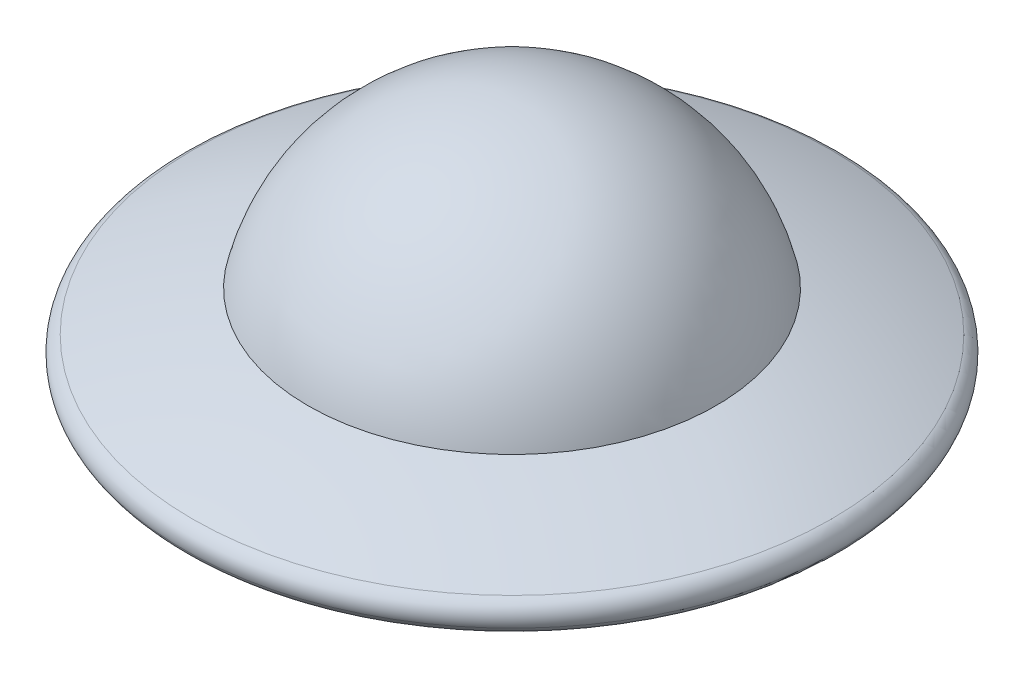
ISO-10303-21;
HEADER;
FILE_DESCRIPTION(('STEP AP214'),'2;1');
FILE_NAME('part.step','',(''),(''),'','','');
FILE_SCHEMA(('AUTOMOTIVE_DESIGN { 1 0 10303 214 1 1 1 1 }'));
ENDSEC;
DATA;
#1=APPLICATION_CONTEXT('core data for automotive mechanical design processes');
#2=APPLICATION_PROTOCOL_DEFINITION('international standard','automotive_design',2000,#1);
#3=PRODUCT_CONTEXT('',#1,'mechanical');
#4=PRODUCT('Part','Part','',(#3));
#5=PRODUCT_RELATED_PRODUCT_CATEGORY('part','',(#4));
#6=PRODUCT_DEFINITION_FORMATION('','',#4);
#7=PRODUCT_DEFINITION_CONTEXT('part definition',#1,'design');
#8=PRODUCT_DEFINITION('design','',#6,#7);
#9=PRODUCT_DEFINITION_SHAPE('','',#8);
#10=(LENGTH_UNIT() NAMED_UNIT(*) SI_UNIT(.MILLI.,.METRE.));
#11=(NAMED_UNIT(*) PLANE_ANGLE_UNIT() SI_UNIT($,.RADIAN.));
#12=(NAMED_UNIT(*) SI_UNIT($,.STERADIAN.) SOLID_ANGLE_UNIT());
#13=UNCERTAINTY_MEASURE_WITH_UNIT(LENGTH_MEASURE(1.E-05),#10,'distance_accuracy_value','');
#14=(GEOMETRIC_REPRESENTATION_CONTEXT(3) GLOBAL_UNCERTAINTY_ASSIGNED_CONTEXT((#13)) GLOBAL_UNIT_ASSIGNED_CONTEXT((#10,
#11,#12)) REPRESENTATION_CONTEXT('',''));
#15=CARTESIAN_POINT('',(0.,0.,0.));
#16=DIRECTION('',(0.,0.,1.));
#17=DIRECTION('',(1.,0.,0.));
#18=AXIS2_PLACEMENT_3D('',#15,#16,#17);
#19=CARTESIAN_POINT('',(0.,43.0842198490352,0.));
#20=DIRECTION('',(0.,1.,0.));
#21=DIRECTION('',(0.,0.,-1.));
#22=AXIS2_PLACEMENT_3D('',#19,#20,#21);
#23=SPHERICAL_SURFACE('',#22,12.5);
#24=CARTESIAN_POINT('',(0.,45.9129817583153,0.));
#25=DIRECTION('',(0.,1.,0.));
#26=DIRECTION('',(0.,0.,1.));
#27=AXIS2_PLACEMENT_3D('',#24,#25,#26);
#28=CIRCLE('',#27,12.1757178868684);
#29=CARTESIAN_POINT('',(0.,45.9129817583153,-12.1757178868683));
#30=VERTEX_POINT('',#29);
#31=EDGE_CURVE('E55',#30,#30,#28,.T.);
#32=ORIENTED_EDGE('',*,*,#31,.T.);
#33=EDGE_LOOP('',(#32));
#34=FACE_BOUND('',#33,.T.);
#35=ADVANCED_FACE('F38',(#34),#23,.T.);
#36=CARTESIAN_POINT('',(0.,43.0842198490352,0.));
#37=DIRECTION('',(0.,1.,0.));
#38=DIRECTION('',(0.,0.,-1.));
#39=AXIS2_PLACEMENT_3D('',#36,#37,#38);
#40=SPHERICAL_SURFACE('',#39,10.5);
#41=CARTESIAN_POINT('',(0.,44.2882569693955,0.));
#42=DIRECTION('',(0.,1.,0.));
#43=DIRECTION('',(0.,0.,1.));
#44=AXIS2_PLACEMENT_3D('',#41,#42,#43);
#45=CIRCLE('',#44,10.4307379706708);
#46=CARTESIAN_POINT('',(0.,44.2882569693955,-10.4307379706708));
#47=VERTEX_POINT('',#46);
#48=EDGE_CURVE('E50',#47,#47,#45,.T.);
#49=ORIENTED_EDGE('',*,*,#48,.F.);
#50=EDGE_LOOP('',(#49));
#51=FACE_BOUND('',#50,.T.);
#52=ADVANCED_FACE('F75',(#51),#40,.F.);
#53=CARTESIAN_POINT('',(0.,0.,0.));
#54=DIRECTION('',(0.,1.,0.));
#55=DIRECTION('',(0.,0.,-1.));
#56=AXIS2_PLACEMENT_3D('',#53,#54,#55);
#57=SPHERICAL_SURFACE('',#56,45.5);
#58=CARTESIAN_POINT('',(0.,41.6726007330605,0.));
#59=DIRECTION('',(0.,-1.,0.));
#60=DIRECTION('',(0.,0.,-1.));
#61=AXIS2_PLACEMENT_3D('',#58,#59,#60);
#62=CIRCLE('',#61,18.2659340889789);
#63=CARTESIAN_POINT('',(0.,41.6726007330605,-18.2659340889789));
#64=VERTEX_POINT('',#63);
#65=EDGE_CURVE('E46',#64,#64,#62,.T.);
#66=CARTESIAN_POINT('',(0.,41.6726007330605,-18.2659340889789));
#67=CARTESIAN_POINT('',(0.,41.7071908005839,-18.1870189928695));
#68=CARTESIAN_POINT('',(0.,41.7415567015851,-18.1080056401219));
#69=CARTESIAN_POINT('',(0.,41.8098390728389,-17.9497849764087));
#70=CARTESIAN_POINT('',(0.,41.8437555430914,-17.8705776654432));
#71=CARTESIAN_POINT('',(0.,41.9111379551433,-17.7119716403523));
#72=CARTESIAN_POINT('',(0.,41.9446038969426,-17.632572926227));
#73=CARTESIAN_POINT('',(0.,42.011084172811,-17.4735866577295));
#74=CARTESIAN_POINT('',(0.,42.0440985068801,-17.3939991033574));
#75=CARTESIAN_POINT('',(0.,42.1096745015446,-17.2346377229246));
#76=CARTESIAN_POINT('',(0.,42.1422361621401,-17.154863896864));
#77=CARTESIAN_POINT('',(0.,42.2069057590034,-16.9951325477447));
#78=CARTESIAN_POINT('',(0.,42.2390136952711,-16.9151750246861));
#79=CARTESIAN_POINT('',(0.,42.3027748071935,-16.7550788621579));
#80=CARTESIAN_POINT('',(0.,42.3344279828482,-16.6749402226883));
#81=CARTESIAN_POINT('',(0.,42.3972785519564,-16.5144844137793));
#82=CARTESIAN_POINT('',(0.,42.4284759454099,-16.4341672443398));
#83=CARTESIAN_POINT('',(0.,42.4904139432324,-16.2733569676919));
#84=CARTESIAN_POINT('',(0.,42.5211545476015,-16.1928638604834));
#85=CARTESIAN_POINT('',(0.,42.5821779751161,-16.031704306177));
#86=CARTESIAN_POINT('',(0.,42.6124607982616,-15.9510378590792));
#87=CARTESIAN_POINT('',(0.,42.6725676859642,-15.7895342284681));
#88=CARTESIAN_POINT('',(0.,42.7023917505213,-15.7086970449548));
#89=CARTESIAN_POINT('',(0.,42.7615801584885,-15.5468545504975));
#90=CARTESIAN_POINT('',(0.,42.7909445018986,-15.4658492395534));
#91=CARTESIAN_POINT('',(0.,42.8492125198506,-15.3036731046451));
#92=CARTESIAN_POINT('',(0.,42.8781161943925,-15.2225022806809));
#93=CARTESIAN_POINT('',(0.,42.9354619417548,-15.0599977394849));
#94=CARTESIAN_POINT('',(0.,42.9639040145751,-14.9786640222531));
#95=CARTESIAN_POINT('',(0.,43.0203256405388,-14.8158363195319));
#96=CARTESIAN_POINT('',(0.,43.0483051936822,-14.7343423340424));
#97=CARTESIAN_POINT('',(0.,43.1038008772643,-14.5711967249884));
#98=CARTESIAN_POINT('',(0.,43.131317007703,-14.4895451014238));
#99=CARTESIAN_POINT('',(0.,43.1858849578047,-14.3260868514896));
#100=CARTESIAN_POINT('',(0.,43.2129367774677,-14.24428022512));
#101=CARTESIAN_POINT('',(0.,43.2665752329324,-14.0805146098486));
#102=CARTESIAN_POINT('',(0.,43.2931618687342,-13.9985556209468));
#103=CARTESIAN_POINT('',(0.,43.3458690984045,-13.8344879258014));
#104=CARTESIAN_POINT('',(0.,43.371989692273,-13.7523792195577));
#105=CARTESIAN_POINT('',(0.,43.4237639950463,-13.5880147397508));
#106=CARTESIAN_POINT('',(0.,43.449417703951,-13.5057589661875));
#107=CARTESIAN_POINT('',(0.,43.5002574088343,-13.3411030065103));
#108=CARTESIAN_POINT('',(0.,43.525443404813,-13.2587028203963));
#109=CARTESIAN_POINT('',(0.,43.5753468709774,-13.0937606950473));
#110=CARTESIAN_POINT('',(0.,43.6000643411631,-13.0112187558123));
#111=CARTESIAN_POINT('',(0.,43.6490299579961,-12.845995788226));
#112=CARTESIAN_POINT('',(0.,43.6732781046434,-12.7633147598747));
#113=CARTESIAN_POINT('',(0.,43.7213042918014,-12.5978162825497));
#114=CARTESIAN_POINT('',(0.,43.7450823323121,-12.5149988335759));
#115=CARTESIAN_POINT('',(0.,43.7921675397708,-12.3492301879024));
#116=CARTESIAN_POINT('',(0.,43.8154747067188,-12.2662789912027));
#117=CARTESIAN_POINT('',(0.,43.8616174148248,-12.100245527291));
#118=CARTESIAN_POINT('',(0.,43.8844529559828,-12.017163260079));
#119=CARTESIAN_POINT('',(0.,43.9296516754972,-11.8508703365853));
#120=CARTESIAN_POINT('',(0.,43.9520148538536,-11.7676596803035));
#121=CARTESIAN_POINT('',(0.,43.9962681260198,-11.6011126642615));
#122=CARTESIAN_POINT('',(0.,44.0181582198297,-11.5177763045012));
#123=CARTESIAN_POINT('',(0.,44.0614646163473,-11.3509805711315));
#124=CARTESIAN_POINT('',(0.,44.0828809190551,-11.267521197522));
#125=CARTESIAN_POINT('',(0.,44.1252390423997,-11.1004821301246));
#126=CARTESIAN_POINT('',(0.,44.1461808630366,-11.0169024363366));
#127=CARTESIAN_POINT('',(0.,44.1875893454819,-10.84962542587));
#128=CARTESIAN_POINT('',(0.,44.2080560072903,-10.7659281091914));
#129=CARTESIAN_POINT('',(0.,44.2485135147715,-10.5984185550213));
#130=CARTESIAN_POINT('',(0.,44.2685043604442,-10.5146063175298));
#131=CARTESIAN_POINT('',(0.,44.2882569693955,-10.4307379706708));
#132=B_SPLINE_CURVE_WITH_KNOTS('',3,(#66,#67,#68,#69,#70,#71,#72,#73,#74,#75,#76,#77,#78,#79,
#80,#81,#82,#83,#84,#85,#86,#87,#88,#89,#90,#91,#92,#93,#94,#95,#96,#97,#98,#99,#100,#101,#102,
#103,#104,#105,#106,#107,#108,#109,#110,#111,#112,#113,#114,#115,#116,#117,#118,#119,#120,#121,
#122,#123,#124,#125,#126,#127,#128,#129,#130,#131),.UNSPECIFIED.,.F.,.F.,(4,2,2,2,2,2,2,2,2,2,2,
2,2,2,2,2,2,2,2,2,2,2,2,2,2,2,2,2,2,2,2,2,4),(0.,0.258488697540797,0.516977395081601,
0.775466092622396,1.0339547901632,1.29244348770399,1.5509321852448,1.80942088278559,
2.0679095803264,2.32639827786719,2.58488697540799,2.84337567294879,3.10186437048958,
3.36035306803039,3.61884176557119,3.87733046311199,4.13581916065278,4.39430785819358,
4.65279655573438,4.91128525327518,5.16977395081599,5.42826264835678,5.68675134589758,
5.94524004343838,6.20372874097917,6.46221743851998,6.72070613606077,6.97919483360158,
7.23768353114237,7.49617222868318,7.75466092622397,8.01314962376478,8.27163832130557),.UNSPECIFIED.);
#133=EDGE_CURVE('BSEAM72',#64,#47,#132,.T.);
#134=ORIENTED_EDGE('',*,*,#65,.T.);
#135=ORIENTED_EDGE('',*,*,#48,.T.);
#136=ORIENTED_EDGE('',*,*,#133,.T.);
#137=ORIENTED_EDGE('',*,*,#133,.F.);
#138=EDGE_LOOP('',(#134,#136,#135,#137));
#139=FACE_BOUND('',#138,.T.);
#140=ADVANCED_FACE('F72',(#139),#57,.F.);
#141=CARTESIAN_POINT('',(0.,0.,0.));
#142=DIRECTION('',(0.,1.,0.));
#143=DIRECTION('',(0.,0.,-1.));
#144=AXIS2_PLACEMENT_3D('',#141,#142,#143);
#145=SPHERICAL_SURFACE('',#144,47.5);
#146=CARTESIAN_POINT('',(0.,43.5043634026456,0.));
#147=DIRECTION('',(0.,-1.,0.));
#148=DIRECTION('',(0.,0.,-1.));
#149=AXIS2_PLACEMENT_3D('',#146,#147,#148);
#150=CIRCLE('',#149,19.0688322906923);
#151=CARTESIAN_POINT('',(0.,43.5043634026456,-19.0688322906923));
#152=VERTEX_POINT('',#151);
#153=EDGE_CURVE('E10',#152,#152,#150,.F.);
#154=CARTESIAN_POINT('',(0.,43.5043634026456,-19.0688322906923));
#155=CARTESIAN_POINT('',(0.,43.5349279876196,-18.9991010811724));
#156=CARTESIAN_POINT('',(0.,43.565324916269,-18.9292963845473));
#157=CARTESIAN_POINT('',(0.,43.6257827642002,-18.7895416337801));
#158=CARTESIAN_POINT('',(0.,43.6558436834819,-18.7195915796381));
#159=CARTESIAN_POINT('',(0.,43.7156288159593,-18.5795477305307));
#160=CARTESIAN_POINT('',(0.,43.7453530291549,-18.5094539355654));
#161=CARTESIAN_POINT('',(0.,43.8044640626087,-18.3691242257293));
#162=CARTESIAN_POINT('',(0.,43.8338508828669,-18.2988883108586));
#163=CARTESIAN_POINT('',(0.,43.892286450838,-18.1582759851745));
#164=CARTESIAN_POINT('',(0.,43.9213351985508,-18.0878995743611));
#165=CARTESIAN_POINT('',(0.,43.97909394979,-17.9470078840675));
#166=CARTESIAN_POINT('',(0.,44.0078039533162,-17.8764926045873));
#167=CARTESIAN_POINT('',(0.,44.0648845523332,-17.7353248074298));
#168=CARTESIAN_POINT('',(0.,44.093255147824,-17.6646722897524));
#169=CARTESIAN_POINT('',(0.,44.1496562747796,-17.5232316498479));
#170=CARTESIAN_POINT('',(0.,44.1776868062446,-17.4524435276207));
#171=CARTESIAN_POINT('',(0.,44.2334071570187,-17.3107333153985));
#172=CARTESIAN_POINT('',(0.,44.2610969763278,-17.2398112254033));
#173=CARTESIAN_POINT('',(0.,44.3161352625389,-17.0978347175247));
#174=CARTESIAN_POINT('',(0.,44.3434837294408,-17.0267802996412));
#175=CARTESIAN_POINT('',(0.,44.397838678479,-16.8845407789252));
#176=CARTESIAN_POINT('',(0.,44.4248451606152,-16.8133556760926));
#177=CARTESIAN_POINT('',(0.,44.4785155156707,-16.6708564314396));
#178=CARTESIAN_POINT('',(0.,44.5051793885901,-16.5995422896191));
#179=CARTESIAN_POINT('',(0.,44.5581639086826,-16.4567866159349));
#180=CARTESIAN_POINT('',(0.,44.5844845558557,-16.3853450840712));
#181=CARTESIAN_POINT('',(0.,44.6367820158629,-16.2423362821908));
#182=CARTESIAN_POINT('',(0.,44.6627588286969,-16.1707690121741));
#183=CARTESIAN_POINT('',(0.,44.7143680193828,-16.0275103887855));
#184=CARTESIAN_POINT('',(0.,44.7400003972348,-15.9558190354135));
#185=CARTESIAN_POINT('',(0.,44.7909201252779,-15.812313902981));
#186=CARTESIAN_POINT('',(0.,44.8162074754691,-15.7405001239204));
#187=CARTESIAN_POINT('',(0.,44.8664365634898,-15.5967518006082));
#188=CARTESIAN_POINT('',(0.,44.8913783013194,-15.5248172563565));
#189=CARTESIAN_POINT('',(0.,44.9409155879072,-15.380829065952));
#190=CARTESIAN_POINT('',(0.,44.9655111366655,-15.3087754197991));
#191=CARTESIAN_POINT('',(0.,45.014355476406,-15.1645506916357));
#192=CARTESIAN_POINT('',(0.,45.0386042673882,-15.0923796096253));
#193=CARTESIAN_POINT('',(0.,45.0867545308894,-14.9479216785062));
#194=CARTESIAN_POINT('',(0.,45.1106560034085,-14.8756348293974));
#195=CARTESIAN_POINT('',(0.,45.1581110773271,-14.7309470355175));
#196=CARTESIAN_POINT('',(0.,45.1816646787267,-14.6585460907463));
#197=CARTESIAN_POINT('',(0.,45.2284234657938,-14.5136317796156));
#198=CARTESIAN_POINT('',(0.,45.2516286514613,-14.4411184132561));
#199=CARTESIAN_POINT('',(0.,45.2976900705075,-14.2959809356223));
#200=CARTESIAN_POINT('',(0.,45.3205463038864,-14.223356824348));
#201=CARTESIAN_POINT('',(0.,45.3659092898674,-14.0779995361187));
#202=CARTESIAN_POINT('',(0.,45.3884160424696,-14.0052663591638));
#203=CARTESIAN_POINT('',(0.,45.4330795464901,-13.8596926213294));
#204=CARTESIAN_POINT('',(0.,45.4552362979084,-13.7868520604499));
#205=CARTESIAN_POINT('',(0.,45.4991992872473,-13.6410652390056));
#206=CARTESIAN_POINT('',(0.,45.5210055251679,-13.5681189784407));
#207=CARTESIAN_POINT('',(0.,45.5642669832994,-13.4221224443078));
#208=CARTESIAN_POINT('',(0.,45.5857222035103,-13.3490721707399));
#209=CARTESIAN_POINT('',(0.,45.6282811301379,-13.2028692996915));
#210=CARTESIAN_POINT('',(0.,45.6493848365546,-13.129716702211));
#211=CARTESIAN_POINT('',(0.,45.691240247595,-12.9833108747825));
#212=CARTESIAN_POINT('',(0.,45.7119919522187,-12.9100576448344));
#213=CARTESIAN_POINT('',(0.,45.7531428799707,-12.7634522462852));
#214=CARTESIAN_POINT('',(0.,45.7735421030989,-12.6901000776839));
#215=CARTESIAN_POINT('',(0.,45.8139875957208,-12.5432984977717));
#216=CARTESIAN_POINT('',(0.,45.8340338652146,-12.4698490864608));
#217=CARTESIAN_POINT('',(0.,45.8737729887792,-12.322854719913));
#218=CARTESIAN_POINT('',(0.,45.89346584285,-12.2493097646762));
#219=CARTESIAN_POINT('',(0.,45.9129817583153,-12.1757178868683));
#220=B_SPLINE_CURVE_WITH_KNOTS('',3,(#154,#155,#156,#157,#158,#159,#160,#161,#162,#163,#164,
#165,#166,#167,#168,#169,#170,#171,#172,#173,#174,#175,#176,#177,#178,#179,#180,#181,#182,#183,
#184,#185,#186,#187,#188,#189,#190,#191,#192,#193,#194,#195,#196,#197,#198,#199,#200,#201,#202,
#203,#204,#205,#206,#207,#208,#209,#210,#211,#212,#213,#214,#215,#216,#217,#218,#219),
.UNSPECIFIED.,.F.,.F.,(4,2,2,2,2,2,2,2,2,2,2,2,2,2,2,2,2,2,2,2,2,2,2,2,2,2,2,2,2,2,2,2,4),(0.,
0.228406695147546,0.456813390295091,0.685220085442635,0.913626780590182,1.14203347573772,
1.37044017088526,1.59884686603281,1.82725356118035,2.0556602563279,2.28406695147544,
2.51247364662299,2.74088034177053,2.96928703691807,3.19769373206562,3.42610042721316,
3.65450712236071,3.88291381750825,4.1113205126558,4.33972720780334,4.56813390295089,
4.79654059809842,5.02494729324597,5.25335398839352,5.48176068354106,5.71016737868861,
5.93857407383615,6.1669807689837,6.39538746413124,6.62379415927878,6.85220085442632,
7.08060754957387,7.30901424472142),.UNSPECIFIED.);
#221=EDGE_CURVE('BSEAM65',#152,#30,#220,.T.);
#222=ORIENTED_EDGE('',*,*,#153,.T.);
#223=ORIENTED_EDGE('',*,*,#31,.F.);
#224=ORIENTED_EDGE('',*,*,#221,.T.);
#225=ORIENTED_EDGE('',*,*,#221,.F.);
#226=EDGE_LOOP('',(#222,#224,#223,#225));
#227=FACE_BOUND('',#226,.T.);
#228=ADVANCED_FACE('F65',(#227),#145,.T.);
#229=CARTESIAN_POINT('',(0.,42.5884820678531,0.));
#230=DIRECTION('',(0.,-1.,0.));
#231=DIRECTION('',(0.,0.,-1.));
#232=AXIS2_PLACEMENT_3D('',#229,#230,#231);
#233=TOROIDAL_SURFACE('',#232,18.6673831898356,1.);
#234=ORIENTED_EDGE('',*,*,#153,.F.);
#235=EDGE_LOOP('',(#234));
#236=FACE_BOUND('',#235,.T.);
#237=CARTESIAN_POINT('',(0.,42.1674294362741,0.));
#238=DIRECTION('',(0.,-1.,0.));
#239=DIRECTION('',(0.,0.,-1.));
#240=AXIS2_PLACEMENT_3D('',#237,#238,#239);
#241=CIRCLE('',#240,19.5744193971837);
#242=CARTESIAN_POINT('',(0.,42.1674294362741,-19.5744193971837));
#243=VERTEX_POINT('',#242);
#244=EDGE_CURVE('E42',#243,#243,#241,.T.);
#245=ORIENTED_EDGE('',*,*,#244,.F.);
#246=EDGE_LOOP('',(#245));
#247=FACE_BOUND('',#246,.T.);
#248=ADVANCED_FACE('F40',(#236,#247),#233,.T.);
#249=CARTESIAN_POINT('',(0.,42.5884820678531,0.));
#250=DIRECTION('',(0.,-1.,0.));
#251=DIRECTION('',(0.,0.,-1.));
#252=AXIS2_PLACEMENT_3D('',#249,#250,#251);
#253=TOROIDAL_SURFACE('',#252,18.6673831898356,1.);
#254=ORIENTED_EDGE('',*,*,#65,.F.);
#255=EDGE_LOOP('',(#254));
#256=FACE_BOUND('',#255,.T.);
#257=ORIENTED_EDGE('',*,*,#244,.T.);
#258=EDGE_LOOP('',(#257));
#259=FACE_BOUND('',#258,.T.);
#260=ADVANCED_FACE('F62',(#256,#259),#253,.T.);
#261=CLOSED_SHELL('',(#35,#52,#140,#228,#248,#260));
#262=MANIFOLD_SOLID_BREP('B2',#261);
#263=ADVANCED_BREP_SHAPE_REPRESENTATION('',(#18,#262),#14);
#264=SHAPE_DEFINITION_REPRESENTATION(#9,#263);
ENDSEC;
END-ISO-10303-21;
